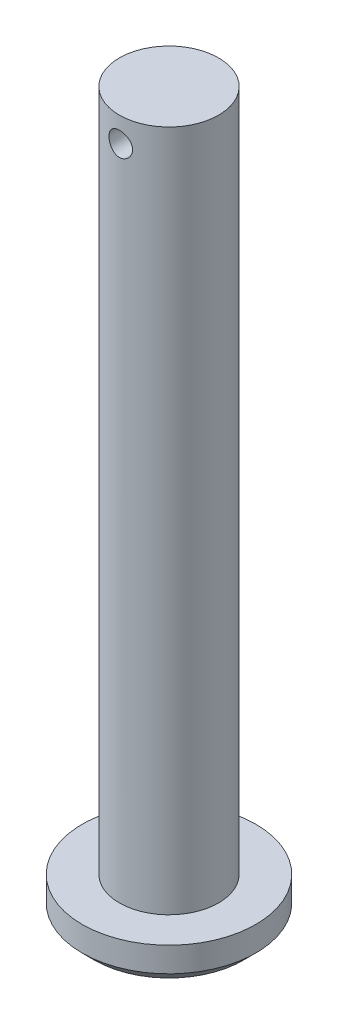
ISO-10303-21;
HEADER;
FILE_DESCRIPTION(('STEP AP214'),'2;1');
FILE_NAME('part.step','',(''),(''),'','','');
FILE_SCHEMA(('AUTOMOTIVE_DESIGN { 1 0 10303 214 1 1 1 1 }'));
ENDSEC;
DATA;
#1=APPLICATION_CONTEXT('core data for automotive mechanical design processes');
#2=APPLICATION_PROTOCOL_DEFINITION('international standard','automotive_design',2000,#1);
#3=PRODUCT_CONTEXT('',#1,'mechanical');
#4=PRODUCT('Part','Part','',(#3));
#5=PRODUCT_RELATED_PRODUCT_CATEGORY('part','',(#4));
#6=PRODUCT_DEFINITION_FORMATION('','',#4);
#7=PRODUCT_DEFINITION_CONTEXT('part definition',#1,'design');
#8=PRODUCT_DEFINITION('design','',#6,#7);
#9=PRODUCT_DEFINITION_SHAPE('','',#8);
#10=(LENGTH_UNIT() NAMED_UNIT(*) SI_UNIT(.MILLI.,.METRE.));
#11=(NAMED_UNIT(*) PLANE_ANGLE_UNIT() SI_UNIT($,.RADIAN.));
#12=(NAMED_UNIT(*) SI_UNIT($,.STERADIAN.) SOLID_ANGLE_UNIT());
#13=UNCERTAINTY_MEASURE_WITH_UNIT(LENGTH_MEASURE(1.E-05),#10,'distance_accuracy_value','');
#14=(GEOMETRIC_REPRESENTATION_CONTEXT(3) GLOBAL_UNCERTAINTY_ASSIGNED_CONTEXT((#13)) GLOBAL_UNIT_ASSIGNED_CONTEXT((#10,
#11,#12)) REPRESENTATION_CONTEXT('',''));
#15=CARTESIAN_POINT('',(0.,0.,0.));
#16=DIRECTION('',(0.,0.,1.));
#17=DIRECTION('',(1.,0.,0.));
#18=AXIS2_PLACEMENT_3D('',#15,#16,#17);
#19=CARTESIAN_POINT('',(0.,-3.,0.));
#20=DIRECTION('',(0.,1.,0.));
#21=DIRECTION('',(0.,0.,1.));
#22=AXIS2_PLACEMENT_3D('',#19,#20,#21);
#23=CYLINDRICAL_SURFACE('',#22,7.);
#24=CARTESIAN_POINT('',(0.,-1.99999999999999,0.));
#25=DIRECTION('',(0.,1.,0.));
#26=DIRECTION('',(0.,0.,1.));
#27=AXIS2_PLACEMENT_3D('',#24,#25,#26);
#28=CIRCLE('',#27,7.);
#29=CARTESIAN_POINT('',(0.,-1.99999999999999,7.));
#30=VERTEX_POINT('',#29);
#31=EDGE_CURVE('E41',#30,#30,#28,.T.);
#32=ORIENTED_EDGE('',*,*,#31,.T.);
#33=EDGE_LOOP('',(#32));
#34=FACE_BOUND('',#33,.T.);
#35=CARTESIAN_POINT('',(0.,0.,0.));
#36=DIRECTION('',(0.,1.,0.));
#37=DIRECTION('',(0.,0.,1.));
#38=AXIS2_PLACEMENT_3D('',#35,#36,#37);
#39=CIRCLE('',#38,7.);
#40=CARTESIAN_POINT('',(0.,0.,7.));
#41=VERTEX_POINT('',#40);
#42=EDGE_CURVE('E100',#41,#41,#39,.T.);
#43=ORIENTED_EDGE('',*,*,#42,.F.);
#44=EDGE_LOOP('',(#43));
#45=FACE_BOUND('',#44,.T.);
#46=ADVANCED_FACE('F33',(#34,#45),#23,.T.);
#47=CARTESIAN_POINT('',(0.,-3.,0.));
#48=DIRECTION('',(0.,1.,0.));
#49=DIRECTION('',(0.,0.,1.));
#50=AXIS2_PLACEMENT_3D('',#47,#48,#49);
#51=PLANE('',#50);
#52=CARTESIAN_POINT('',(0.,-3.,0.));
#53=DIRECTION('',(0.,1.,0.));
#54=DIRECTION('',(0.,0.,1.));
#55=AXIS2_PLACEMENT_3D('',#52,#53,#54);
#56=CIRCLE('',#55,5.99999999999998);
#57=CARTESIAN_POINT('',(0.,-3.,5.99999999999998));
#58=VERTEX_POINT('',#57);
#59=EDGE_CURVE('E10',#58,#58,#56,.F.);
#60=ORIENTED_EDGE('',*,*,#59,.T.);
#61=EDGE_LOOP('',(#60));
#62=FACE_BOUND('',#61,.T.);
#63=ADVANCED_FACE('F83',(#62),#51,.F.);
#64=CARTESIAN_POINT('',(0.,0.,0.));
#65=DIRECTION('',(0.,1.,0.));
#66=DIRECTION('',(0.,0.,1.));
#67=AXIS2_PLACEMENT_3D('',#64,#65,#66);
#68=PLANE('',#67);
#69=CARTESIAN_POINT('',(0.,0.,0.));
#70=DIRECTION('',(0.,1.,0.));
#71=DIRECTION('',(0.,0.,1.));
#72=AXIS2_PLACEMENT_3D('',#69,#70,#71);
#73=CIRCLE('',#72,4.);
#74=CARTESIAN_POINT('',(0.,0.,4.));
#75=VERTEX_POINT('',#74);
#76=EDGE_CURVE('E49',#75,#75,#73,.T.);
#77=ORIENTED_EDGE('',*,*,#76,.F.);
#78=EDGE_LOOP('',(#77));
#79=FACE_BOUND('',#78,.T.);
#80=ORIENTED_EDGE('',*,*,#42,.T.);
#81=EDGE_LOOP('',(#80));
#82=FACE_BOUND('',#81,.T.);
#83=ADVANCED_FACE('F79',(#79,#82),#68,.T.);
#84=CARTESIAN_POINT('',(0.,55.,0.));
#85=DIRECTION('',(0.,-1.,0.));
#86=DIRECTION('',(0.,0.,-1.));
#87=AXIS2_PLACEMENT_3D('',#84,#85,#86);
#88=CYLINDRICAL_SURFACE('',#87,4.);
#89=CARTESIAN_POINT('',(-0.95,53.,3.88555015409659));
#90=CARTESIAN_POINT('',(-0.949998366385795,53.0525480392456,3.88555119658447));
#91=CARTESIAN_POINT('',(-0.945625214347678,53.1051147727544,3.88662777084838));
#92=CARTESIAN_POINT('',(-0.928272377596758,53.2087447799121,3.89080804298714));
#93=CARTESIAN_POINT('',(-0.915287184591519,53.2598070694678,3.89391303822829));
#94=CARTESIAN_POINT('',(-0.881149268434963,53.3589142527183,3.90177911038668));
#95=CARTESIAN_POINT('',(-0.860006428752922,53.4069627162588,3.90653818260282));
#96=CARTESIAN_POINT('',(-0.810182790178989,53.4988341555609,3.91717372245091));
#97=CARTESIAN_POINT('',(-0.781501865442132,53.5426570607621,3.92305020873714));
#98=CARTESIAN_POINT('',(-0.716807680169345,53.6257047708797,3.93538912387704));
#99=CARTESIAN_POINT('',(-0.680672374015556,53.6648332417439,3.94186015741135));
#100=CARTESIAN_POINT('',(-0.602358310692674,53.7365347549474,3.9545841222894));
#101=CARTESIAN_POINT('',(-0.560179030101743,53.7691072289344,3.96083703468498));
#102=CARTESIAN_POINT('',(-0.470320149807634,53.8271608764587,3.97251482162618));
#103=CARTESIAN_POINT('',(-0.422578335238791,53.8525482278961,3.97792835730083));
#104=CARTESIAN_POINT('',(-0.323355281554751,53.8949022119194,3.98721966649302));
#105=CARTESIAN_POINT('',(-0.271874539966059,53.9118699625286,3.99109764390069));
#106=CARTESIAN_POINT('',(-0.167638263268302,53.9365968296962,3.99682007391831));
#107=CARTESIAN_POINT('',(-0.114923496016075,53.9445193216035,3.9987005602098));
#108=CARTESIAN_POINT('',(-0.00888180404808099,53.9514427687046,4.00034139793232));
#109=CARTESIAN_POINT('',(0.0444450376939674,53.9504449192147,4.00010203342113));
#110=CARTESIAN_POINT('',(0.149066874564699,53.9396752466734,3.99755726020232));
#111=CARTESIAN_POINT('',(0.200381171649827,53.9300796635352,3.99529335320897));
#112=CARTESIAN_POINT('',(0.300649456938187,53.9026691761224,3.98900175091233));
#113=CARTESIAN_POINT('',(0.349603326627055,53.8848538596181,3.98497396714895));
#114=CARTESIAN_POINT('',(0.444235754849386,53.8413615691556,3.97554232938614));
#115=CARTESIAN_POINT('',(0.489883551839127,53.8156201933928,3.97012726618428));
#116=CARTESIAN_POINT('',(0.576274415240522,53.7570549763501,3.9585111535359));
#117=CARTESIAN_POINT('',(0.61701670220965,53.7242300118576,3.95230997950376));
#118=CARTESIAN_POINT('',(0.693490090116475,53.6514783712545,3.93962089598158));
#119=CARTESIAN_POINT('',(0.729074148815461,53.6113975533269,3.93312968327407));
#120=CARTESIAN_POINT('',(0.793046400952024,53.5257695548755,3.92073236244736));
#121=CARTESIAN_POINT('',(0.821434321790248,53.4802221673671,3.9148262764987));
#122=CARTESIAN_POINT('',(0.870290427474959,53.3846867372124,3.90425726360328));
#123=CARTESIAN_POINT('',(0.890726398768535,53.3346816204803,3.89959941652524));
#124=CARTESIAN_POINT('',(0.922857992618089,53.2318090288732,3.89212129602027));
#125=CARTESIAN_POINT('',(0.934555281006105,53.1789421015994,3.88930067238144));
#126=CARTESIAN_POINT('',(0.948640150073782,53.0732019490553,3.88588903434823));
#127=CARTESIAN_POINT('',(0.951243768155168,53.0203591352807,3.8852462915152));
#128=CARTESIAN_POINT('',(0.94765613074484,52.9149943332638,3.88612290482417));
#129=CARTESIAN_POINT('',(0.94146559806338,52.8624723190107,3.8876420832732));
#130=CARTESIAN_POINT('',(0.920654019411596,52.7600212801005,3.89262209093516));
#131=CARTESIAN_POINT('',(0.906155910822365,52.7100657754889,3.89605458670746));
#132=CARTESIAN_POINT('',(0.869275695627034,52.6132935436561,3.90444812874248));
#133=CARTESIAN_POINT('',(0.846892726996901,52.5664771602905,3.90940934212708));
#134=CARTESIAN_POINT('',(0.794416189355449,52.4763886277408,3.92041218658714));
#135=CARTESIAN_POINT('',(0.764191829227681,52.4331948777973,3.92647156008142));
#136=CARTESIAN_POINT('',(0.697058205673847,52.3524129550158,3.93894313562688));
#137=CARTESIAN_POINT('',(0.660147955508433,52.3148256110961,3.94535538966067));
#138=CARTESIAN_POINT('',(0.579704501599117,52.2454635738074,3.95798355973407));
#139=CARTESIAN_POINT('',(0.536041793133146,52.2138374472024,3.96419189239773));
#140=CARTESIAN_POINT('',(0.44389890135051,52.1583676531393,3.9755635343327));
#141=CARTESIAN_POINT('',(0.395418961162979,52.1345235931746,3.98072689630454));
#142=CARTESIAN_POINT('',(0.295342502269511,52.0954908840695,3.98939535866095));
#143=CARTESIAN_POINT('',(0.243770296420001,52.0802425496044,3.99291186453037));
#144=CARTESIAN_POINT('',(0.138701882707193,52.0586515875868,3.99794009464609));
#145=CARTESIAN_POINT('',(0.085206009394754,52.052307419093,3.99945216577429));
#146=CARTESIAN_POINT('',(-0.0207896064205041,52.0487844156731,4.0002885918271));
#147=CARTESIAN_POINT('',(-0.0732817299154621,52.0513853113033,3.99966552523578));
#148=CARTESIAN_POINT('',(-0.177058003591494,52.0651789935283,3.99641664154496));
#149=CARTESIAN_POINT('',(-0.228342183460653,52.0763715687347,3.99379087371966));
#150=CARTESIAN_POINT('',(-0.328041015431032,52.1069177268473,3.98683803404943));
#151=CARTESIAN_POINT('',(-0.37646735416905,52.1262350015487,3.98251853700102));
#152=CARTESIAN_POINT('',(-0.469418177614436,52.1724485471967,3.97263562042283));
#153=CARTESIAN_POINT('',(-0.513942213796519,52.1993456878688,3.96707205816221));
#154=CARTESIAN_POINT('',(-0.598881797617394,52.2606465162429,3.95515134706186));
#155=CARTESIAN_POINT('',(-0.639185750890861,52.2952019731106,3.94877946304627));
#156=CARTESIAN_POINT('',(-0.713497872024469,52.3705390503303,3.93603169626298));
#157=CARTESIAN_POINT('',(-0.747504478179234,52.4113222105532,3.92965581289578));
#158=CARTESIAN_POINT('',(-0.80880012611914,52.4987618594738,3.91750394866502));
#159=CARTESIAN_POINT('',(-0.835969891162668,52.5455036798704,3.91173951716314));
#160=CARTESIAN_POINT('',(-0.882024967652498,52.6430200906236,3.90161403146148));
#161=CARTESIAN_POINT('',(-0.90091672283727,52.6937915077814,3.89725188640608));
#162=CARTESIAN_POINT('',(-0.926831562053166,52.7871132481922,3.89115917080241));
#163=CARTESIAN_POINT('',(-0.935501763545243,52.8291904802568,3.8890708196325));
#164=CARTESIAN_POINT('',(-0.947086452900724,52.9141743558729,3.88626593244295));
#165=CARTESIAN_POINT('',(-0.95000133426828,52.9570809425169,3.88554930263575));
#166=CARTESIAN_POINT('',(-0.95,53.,3.88555015409659));
#167=B_SPLINE_CURVE_WITH_KNOTS('',3,(#89,#90,#91,#92,#93,#94,#95,#96,#97,#98,#99,#100,#101,#102,
#103,#104,#105,#106,#107,#108,#109,#110,#111,#112,#113,#114,#115,#116,#117,#118,#119,#120,#121,
#122,#123,#124,#125,#126,#127,#128,#129,#130,#131,#132,#133,#134,#135,#136,#137,#138,#139,#140,
#141,#142,#143,#144,#145,#146,#147,#148,#149,#150,#151,#152,#153,#154,#155,#156,#157,#158,#159,
#160,#161,#162,#163,#164,#165,#166),.UNSPECIFIED.,.T.,.F.,(4,2,2,2,2,2,2,2,2,2,2,2,2,2,2,2,2,2,
2,2,2,2,2,2,2,2,2,2,2,2,2,2,2,2,2,2,2,2,4),(0.,0.157486642863022,0.315074112017903,
0.472471251182708,0.629871018189388,0.790087903096128,0.950318671542176,1.11255417690157,
1.2747681335394,1.43400337941495,1.59321728825759,1.74924039239735,1.90527132213904,
2.06260509144077,2.21996382680071,2.38117364286885,2.54238956486874,2.70425194156266,
2.86608345498049,3.0240431820193,3.18198992675795,3.33765757241444,3.49334224195186,
3.6518123849235,3.81030593484878,3.97233924111705,4.13436437359815,4.29525015428154,
4.45610808888229,4.61303359925174,4.76995524877091,4.92618296476412,5.08242861387174,
5.24210285634097,5.4018166442159,5.56414896886739,5.72635470592196,5.85499205495926,
5.98362060846773),.UNSPECIFIED.);
#168=CARTESIAN_POINT('',(-0.95,53.,3.88555015409659));
#169=VERTEX_POINT('',#168);
#170=EDGE_CURVE('E52',#169,#169,#167,.T.);
#171=ORIENTED_EDGE('',*,*,#170,.T.);
#172=EDGE_LOOP('',(#171));
#173=FACE_BOUND('',#172,.T.);
#174=CARTESIAN_POINT('',(0.,53.95,-4.));
#175=CARTESIAN_POINT('',(-0.0525716159169858,53.9499983816701,-3.99999906469199));
#176=CARTESIAN_POINT('',(-0.105161891392819,53.9456214387021,-3.99895317185943));
#177=CARTESIAN_POINT('',(-0.208840750015937,53.9282521816122,-3.99488209966177));
#178=CARTESIAN_POINT('',(-0.259928369155544,53.9152544576423,-3.99185567745966));
#179=CARTESIAN_POINT('',(-0.359089250491863,53.8810799183793,-3.98415944205558));
#180=CARTESIAN_POINT('',(-0.407165867393611,53.8599124008961,-3.97949149755827));
#181=CARTESIAN_POINT('',(-0.499084935171158,53.8100305570737,-3.96901210268168));
#182=CARTESIAN_POINT('',(-0.5429273458768,53.7813161591463,-3.96320064145538));
#183=CARTESIAN_POINT('',(-0.625954950183177,53.7165873562835,-3.95094585351953));
#184=CARTESIAN_POINT('',(-0.665049549864639,53.6804584377085,-3.94449355322159));
#185=CARTESIAN_POINT('',(-0.736685145331755,53.6021716119794,-3.9317453871489));
#186=CARTESIAN_POINT('',(-0.769225469017969,53.5600130872846,-3.92544953747513));
#187=CARTESIAN_POINT('',(-0.827243901664242,53.4701742865347,-3.91363751271594));
#188=CARTESIAN_POINT('',(-0.852622702939508,53.422428237348,-3.90813277607999));
#189=CARTESIAN_POINT('',(-0.8949597345937,53.3231960811483,-3.89865629675525));
#190=CARTESIAN_POINT('',(-0.911919168217192,53.2717105097711,-3.89468433502972));
#191=CARTESIAN_POINT('',(-0.93663097666731,53.1674515700497,-3.88881502948517));
#192=CARTESIAN_POINT('',(-0.944545232811815,53.1147186681084,-3.88688125891104));
#193=CARTESIAN_POINT('',(-0.951445911981742,53.0086408840544,-3.88519810196589));
#194=CARTESIAN_POINT('',(-0.950433638119197,52.955296092402,-3.88544839676076));
#195=CARTESIAN_POINT('',(-0.939639609917527,52.8507337810538,-3.88807224775455));
#196=CARTESIAN_POINT('',(-0.930048710483161,52.7994952208062,-3.89039959182489));
#197=CARTESIAN_POINT('',(-0.902673271472568,52.6993759165973,-3.89684190578202));
#198=CARTESIAN_POINT('',(-0.884888199211801,52.6504953261504,-3.90095699188486));
#199=CARTESIAN_POINT('',(-0.841461453464167,52.5559575032054,-3.9105548253172));
#200=CARTESIAN_POINT('',(-0.815748817046493,52.5103341655725,-3.91604983900591));
#201=CARTESIAN_POINT('',(-0.757246563518836,52.4239803587791,-3.9277812104864));
#202=CARTESIAN_POINT('',(-0.724455820277354,52.3832506698085,-3.93401768617427));
#203=CARTESIAN_POINT('',(-0.651730542122148,52.3067444235236,-3.94672541410529));
#204=CARTESIAN_POINT('',(-0.611634422022609,52.2711216087745,-3.95319858648444));
#205=CARTESIAN_POINT('',(-0.525961333282163,52.2070781751939,-3.96550559399558));
#206=CARTESIAN_POINT('',(-0.480384227811707,52.1786577362204,-3.97133941315954));
#207=CARTESIAN_POINT('',(-0.384836770537651,52.1297771176461,-3.98173500028595));
#208=CARTESIAN_POINT('',(-0.334854244791346,52.109339901596,-3.98629308813007));
#209=CARTESIAN_POINT('',(-0.232031297141888,52.0771991027518,-3.99359668454635));
#210=CARTESIAN_POINT('',(-0.17919136888472,52.0654940165284,-3.99634250513101));
#211=CARTESIAN_POINT('',(-0.073469774086885,52.0513798849699,-3.99966674218909));
#212=CARTESIAN_POINT('',(-0.0206175898746296,52.0487612140173,-4.00029402456828));
#213=CARTESIAN_POINT('',(0.0847693912894521,52.0523221089154,-3.99944875545038));
#214=CARTESIAN_POINT('',(0.137304213515183,52.0585009646245,-3.99797637343947));
#215=CARTESIAN_POINT('',(0.239850803389257,52.079308240782,-3.99312833707979));
#216=CARTESIAN_POINT('',(0.289886711620184,52.093824126681,-3.98977804526624));
#217=CARTESIAN_POINT('',(0.386811992305044,52.1307663813307,-3.98155050554334));
#218=CARTESIAN_POINT('',(0.433701065520283,52.1531935011112,-3.97667311266811));
#219=CARTESIAN_POINT('',(0.523849378276181,52.2057404221104,-3.96581376248466));
#220=CARTESIAN_POINT('',(0.567036723487757,52.2359800196308,-3.95981504718028));
#221=CARTESIAN_POINT('',(0.647798786117561,52.3031385050763,-3.94740789681519));
#222=CARTESIAN_POINT('',(0.685372632929673,52.340058427104,-3.94099939842023));
#223=CARTESIAN_POINT('',(0.754690657932372,52.4204985426164,-3.92832194607314));
#224=CARTESIAN_POINT('',(0.786288509801902,52.4641459982554,-3.92205915749654));
#225=CARTESIAN_POINT('',(0.841708668643173,52.5562493942518,-3.91054099753535));
#226=CARTESIAN_POINT('',(0.865531323579626,52.6047051192973,-3.90528558107201));
#227=CARTESIAN_POINT('',(0.904552385519318,52.7047850887021,-3.89643241208044));
#228=CARTESIAN_POINT('',(0.919801508214679,52.7563886549479,-3.89282493569091));
#229=CARTESIAN_POINT('',(0.941383482274679,52.8615244025194,-3.88766286660848));
#230=CARTESIAN_POINT('',(0.94771806041669,52.9150562082775,-3.88610787634571));
#231=CARTESIAN_POINT('',(0.951207673286703,53.0210458000307,-3.88525500882718));
#232=CARTESIAN_POINT('',(0.948595748816157,53.0734955816251,-3.88589982858001));
#233=CARTESIAN_POINT('',(0.934794720821822,53.1771841720102,-3.88924263620545));
#234=CARTESIAN_POINT('',(0.923605758318629,53.2284230006966,-3.89194059032116));
#235=CARTESIAN_POINT('',(0.893089656089786,53.3280101293009,-3.89905535379612));
#236=CARTESIAN_POINT('',(0.873802178709804,53.3763712224052,-3.90346377826989));
#237=CARTESIAN_POINT('',(0.827668720259462,53.4692035999337,-3.91350473785678));
#238=CARTESIAN_POINT('',(0.800821795119378,53.5136743976044,-3.91913742584329));
#239=CARTESIAN_POINT('',(0.739583444580444,53.5985994868327,-3.93115888085215));
#240=CARTESIAN_POINT('',(0.705028469753709,53.6389337797866,-3.93756238942864));
#241=CARTESIAN_POINT('',(0.629678998393119,53.7133073136056,-3.95031159366473));
#242=CARTESIAN_POINT('',(0.588883042004166,53.7473450774961,-3.95665727542887));
#243=CARTESIAN_POINT('',(0.501426734883567,53.8086836180133,-3.96869602920727));
#244=CARTESIAN_POINT('',(0.454683431807124,53.8358686336144,-3.97437711633985));
#245=CARTESIAN_POINT('',(0.357161890174494,53.8819518398314,-3.98432297774674));
#246=CARTESIAN_POINT('',(0.306386786355228,53.9008563954307,-3.98858883925562));
#247=CARTESIAN_POINT('',(0.213033333424225,53.9267994185641,-3.99453812005878));
#248=CARTESIAN_POINT('',(0.170926491446314,53.9354817737408,-3.9965728416634));
#249=CARTESIAN_POINT('',(0.0858838835983434,53.9470825495428,-3.99930412283101));
#250=CARTESIAN_POINT('',(0.0429481685002918,53.950001322088,-4.00000076409609));
#251=CARTESIAN_POINT('',(0.,53.95,-4.));
#252=B_SPLINE_CURVE_WITH_KNOTS('',3,(#174,#175,#176,#177,#178,#179,#180,#181,#182,#183,#184,
#185,#186,#187,#188,#189,#190,#191,#192,#193,#194,#195,#196,#197,#198,#199,#200,#201,#202,#203,
#204,#205,#206,#207,#208,#209,#210,#211,#212,#213,#214,#215,#216,#217,#218,#219,#220,#221,#222,
#223,#224,#225,#226,#227,#228,#229,#230,#231,#232,#233,#234,#235,#236,#237,#238,#239,#240,#241,
#242,#243,#244,#245,#246,#247,#248,#249,#250,#251),.UNSPECIFIED.,.T.,.F.,(4,2,2,2,2,2,2,2,2,2,2,
2,2,2,2,2,2,2,2,2,2,2,2,2,2,2,2,2,2,2,2,2,2,2,2,2,2,2,4),(0.,0.157557535642248,
0.315214037931965,0.472691642396622,0.630170740713638,0.790294937874523,0.950435546406423,
1.11269843184274,1.27493812097867,1.43422636061928,1.59349134744105,1.7492988291963,
1.90511644107104,2.06237145603622,2.21965150884402,2.38096351149933,2.54227954204942,
2.70405623620997,2.86580507050254,3.02379657108821,3.18177531922635,3.33767014759884,
3.49357977937187,3.65203889731466,3.81052256547087,3.97249049929225,4.13445118354089,
4.29544344782794,4.45640452307555,4.61320507252327,4.77000304396765,4.92604189533595,
5.08210024243283,5.24185280413888,5.40164279156039,5.56397421305201,5.72618063450725,
5.85490448453998,5.98362047455139),.UNSPECIFIED.);
#253=CARTESIAN_POINT('',(0.,53.95,-4.));
#254=VERTEX_POINT('',#253);
#255=EDGE_CURVE('E45',#254,#254,#252,.T.);
#256=ORIENTED_EDGE('',*,*,#255,.T.);
#257=EDGE_LOOP('',(#256));
#258=FACE_BOUND('',#257,.T.);
#259=CARTESIAN_POINT('',(0.,55.,0.));
#260=DIRECTION('',(0.,1.,0.));
#261=DIRECTION('',(0.,0.,1.));
#262=AXIS2_PLACEMENT_3D('',#259,#260,#261);
#263=CIRCLE('',#262,4.);
#264=CARTESIAN_POINT('',(0.,55.,4.));
#265=VERTEX_POINT('',#264);
#266=EDGE_CURVE('E59',#265,#265,#263,.T.);
#267=ORIENTED_EDGE('',*,*,#266,.F.);
#268=EDGE_LOOP('',(#267));
#269=FACE_BOUND('',#268,.T.);
#270=ORIENTED_EDGE('',*,*,#76,.T.);
#271=EDGE_LOOP('',(#270));
#272=FACE_BOUND('',#271,.T.);
#273=ADVANCED_FACE('F64',(#173,#258,#269,#272),#88,.T.);
#274=CARTESIAN_POINT('',(0.,55.,0.));
#275=DIRECTION('',(0.,1.,0.));
#276=DIRECTION('',(0.,0.,1.));
#277=AXIS2_PLACEMENT_3D('',#274,#275,#276);
#278=PLANE('',#277);
#279=ORIENTED_EDGE('',*,*,#266,.T.);
#280=EDGE_LOOP('',(#279));
#281=FACE_BOUND('',#280,.T.);
#282=ADVANCED_FACE('F71',(#281),#278,.T.);
#283=CARTESIAN_POINT('',(0.,53.,7.));
#284=DIRECTION('',(0.,0.,-1.));
#285=DIRECTION('',(-1.,0.,0.));
#286=AXIS2_PLACEMENT_3D('',#283,#284,#285);
#287=CYLINDRICAL_SURFACE('',#286,0.95);
#288=ORIENTED_EDGE('',*,*,#170,.F.);
#289=EDGE_LOOP('',(#288));
#290=FACE_BOUND('',#289,.T.);
#291=ORIENTED_EDGE('',*,*,#255,.F.);
#292=EDGE_LOOP('',(#291));
#293=FACE_BOUND('',#292,.T.);
#294=ADVANCED_FACE('F68',(#290,#293),#287,.F.);
#295=CARTESIAN_POINT('',(0.,-1.99999999999999,0.));
#296=DIRECTION('',(0.,1.,0.));
#297=DIRECTION('',(0.,0.,1.));
#298=AXIS2_PLACEMENT_3D('',#295,#296,#297);
#299=CONICAL_SURFACE('',#298,7.,0.785398163397453);
#300=ORIENTED_EDGE('',*,*,#59,.F.);
#301=EDGE_LOOP('',(#300));
#302=FACE_BOUND('',#301,.T.);
#303=ORIENTED_EDGE('',*,*,#31,.F.);
#304=EDGE_LOOP('',(#303));
#305=FACE_BOUND('',#304,.T.);
#306=ADVANCED_FACE('F36',(#302,#305),#299,.T.);
#307=CLOSED_SHELL('',(#46,#63,#83,#273,#282,#294,#306));
#308=MANIFOLD_SOLID_BREP('B2',#307);
#309=ADVANCED_BREP_SHAPE_REPRESENTATION('',(#18,#308),#14);
#310=SHAPE_DEFINITION_REPRESENTATION(#9,#309);
ENDSEC;
END-ISO-10303-21;
